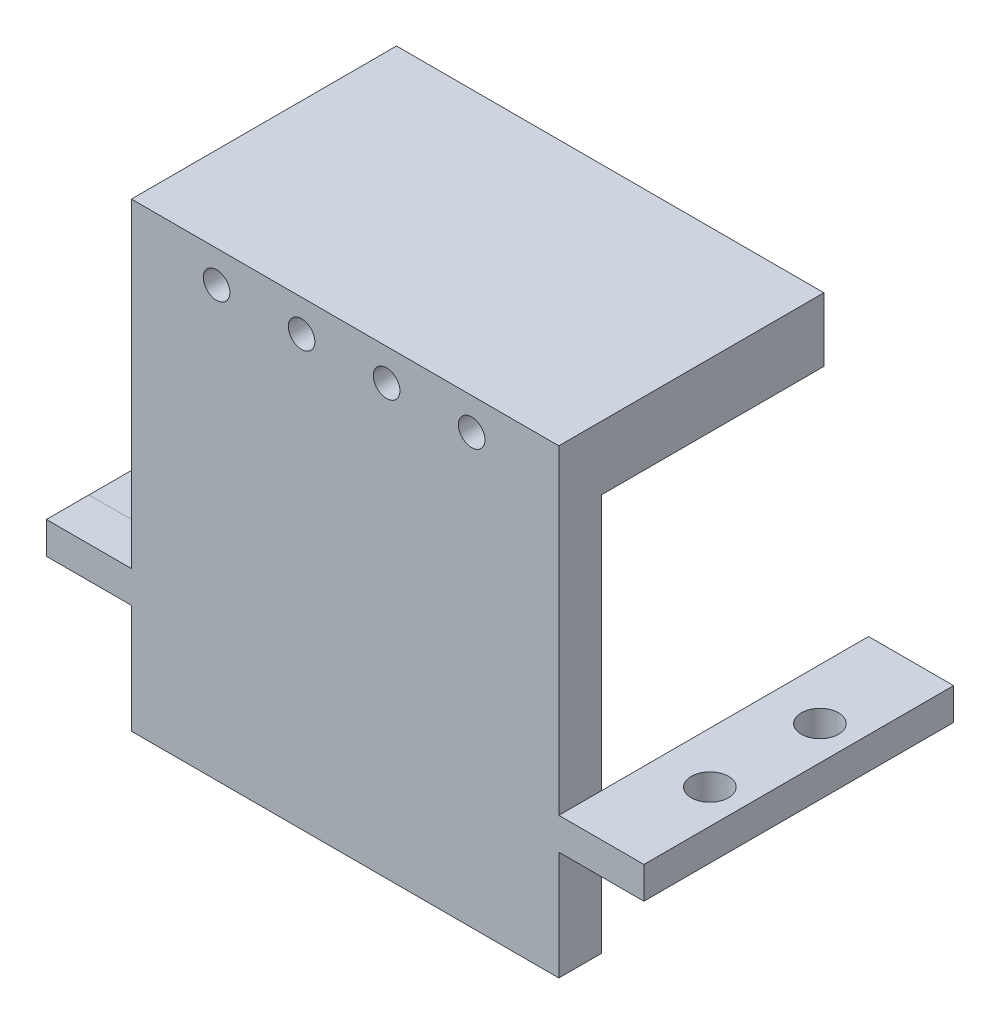
ISO-10303-21;
HEADER;
FILE_DESCRIPTION(('STEP AP214'),'2;1');
FILE_NAME('part.step','',(''),(''),'','','');
FILE_SCHEMA(('AUTOMOTIVE_DESIGN { 1 0 10303 214 1 1 1 1 }'));
ENDSEC;
DATA;
#1=APPLICATION_CONTEXT('core data for automotive mechanical design processes');
#2=APPLICATION_PROTOCOL_DEFINITION('international standard','automotive_design',2000,#1);
#3=PRODUCT_CONTEXT('',#1,'mechanical');
#4=PRODUCT('Part','Part','',(#3));
#5=PRODUCT_RELATED_PRODUCT_CATEGORY('part','',(#4));
#6=PRODUCT_DEFINITION_FORMATION('','',#4);
#7=PRODUCT_DEFINITION_CONTEXT('part definition',#1,'design');
#8=PRODUCT_DEFINITION('design','',#6,#7);
#9=PRODUCT_DEFINITION_SHAPE('','',#8);
#10=(LENGTH_UNIT() NAMED_UNIT(*) SI_UNIT(.MILLI.,.METRE.));
#11=(NAMED_UNIT(*) PLANE_ANGLE_UNIT() SI_UNIT($,.RADIAN.));
#12=(NAMED_UNIT(*) SI_UNIT($,.STERADIAN.) SOLID_ANGLE_UNIT());
#13=UNCERTAINTY_MEASURE_WITH_UNIT(LENGTH_MEASURE(1.E-05),#10,'distance_accuracy_value','');
#14=(GEOMETRIC_REPRESENTATION_CONTEXT(3) GLOBAL_UNCERTAINTY_ASSIGNED_CONTEXT((#13)) GLOBAL_UNIT_ASSIGNED_CONTEXT((#10,
#11,#12)) REPRESENTATION_CONTEXT('',''));
#15=CARTESIAN_POINT('',(0.,0.,0.));
#16=DIRECTION('',(0.,0.,1.));
#17=DIRECTION('',(1.,0.,0.));
#18=AXIS2_PLACEMENT_3D('',#15,#16,#17);
#19=CARTESIAN_POINT('',(0.,0.,-20.93));
#20=DIRECTION('',(0.,0.,1.));
#21=DIRECTION('',(1.,0.,0.));
#22=AXIS2_PLACEMENT_3D('',#19,#20,#21);
#23=PLANE('',#22);
#24=CARTESIAN_POINT('',(-106.644230049022,-11.0591164996487,-20.93));
#25=DIRECTION('',(0.,0.,1.));
#26=DIRECTION('',(1.,0.,0.));
#27=AXIS2_PLACEMENT_3D('',#24,#25,#26);
#28=CIRCLE('',#27,1.25);
#29=CARTESIAN_POINT('',(-105.394230049022,-11.0591164996487,-20.93));
#30=VERTEX_POINT('',#29);
#31=EDGE_CURVE('E367',#30,#30,#28,.F.);
#32=ORIENTED_EDGE('',*,*,#31,.F.);
#33=EDGE_LOOP('',(#32));
#34=FACE_BOUND('',#33,.T.);
#35=CARTESIAN_POINT('',(-122.644230049022,-11.0591164996487,-20.93));
#36=DIRECTION('',(0.,0.,1.));
#37=DIRECTION('',(1.,0.,0.));
#38=AXIS2_PLACEMENT_3D('',#35,#36,#37);
#39=CIRCLE('',#38,1.25);
#40=CARTESIAN_POINT('',(-121.394230049022,-11.0591164996487,-20.93));
#41=VERTEX_POINT('',#40);
#42=EDGE_CURVE('E370',#41,#41,#39,.F.);
#43=ORIENTED_EDGE('',*,*,#42,.F.);
#44=EDGE_LOOP('',(#43));
#45=FACE_BOUND('',#44,.T.);
#46=CARTESIAN_POINT('',(-114.644230049022,-11.0591164996487,-20.93));
#47=DIRECTION('',(0.,0.,1.));
#48=DIRECTION('',(1.,0.,0.));
#49=AXIS2_PLACEMENT_3D('',#46,#47,#48);
#50=CIRCLE('',#49,1.25);
#51=CARTESIAN_POINT('',(-113.394230049022,-11.0591164996487,-20.93));
#52=VERTEX_POINT('',#51);
#53=EDGE_CURVE('E355',#52,#52,#50,.F.);
#54=ORIENTED_EDGE('',*,*,#53,.F.);
#55=EDGE_LOOP('',(#54));
#56=FACE_BOUND('',#55,.T.);
#57=DIRECTION('',(0.,-1.,0.));
#58=VECTOR('',#57,1.);
#59=CARTESIAN_POINT('',(-98.4442300490215,-8.05911649459758,-20.93));
#60=LINE('',#59,#58);
#61=CARTESIAN_POINT('',(-98.4442300490215,-8.05911649459758,-20.93));
#62=VERTEX_POINT('',#61);
#63=CARTESIAN_POINT('',(-98.4442300490215,-14.0591164945976,-20.93));
#64=VERTEX_POINT('',#63);
#65=EDGE_CURVE('E354',#62,#64,#60,.T.);
#66=ORIENTED_EDGE('',*,*,#65,.T.);
#67=DIRECTION('',(-1.,0.,0.));
#68=VECTOR('',#67,1.);
#69=CARTESIAN_POINT('',(-138.644230049022,-14.0591164945976,-20.93));
#70=LINE('',#69,#68);
#71=CARTESIAN_POINT('',(-138.644230049022,-14.0591164945976,-20.93));
#72=VERTEX_POINT('',#71);
#73=EDGE_CURVE('E360',#64,#72,#70,.T.);
#74=ORIENTED_EDGE('',*,*,#73,.T.);
#75=DIRECTION('',(0.,1.,0.));
#76=VECTOR('',#75,1.);
#77=CARTESIAN_POINT('',(-138.644230049022,-14.0591164945976,-20.93));
#78=LINE('',#77,#76);
#79=CARTESIAN_POINT('',(-138.644230049022,-8.05911649459758,-20.93));
#80=VERTEX_POINT('',#79);
#81=EDGE_CURVE('E357',#72,#80,#78,.T.);
#82=ORIENTED_EDGE('',*,*,#81,.T.);
#83=DIRECTION('',(1.,0.,0.));
#84=VECTOR('',#83,1.);
#85=CARTESIAN_POINT('',(-138.644230049022,-8.05911649459758,-20.93));
#86=LINE('',#85,#84);
#87=EDGE_CURVE('E350',#80,#62,#86,.T.);
#88=ORIENTED_EDGE('',*,*,#87,.T.);
#89=EDGE_LOOP('',(#66,#74,#82,#88));
#90=FACE_BOUND('',#89,.T.);
#91=CARTESIAN_POINT('',(-130.63625074283,-11.0591164945976,-20.93));
#92=DIRECTION('',(0.,0.,1.));
#93=DIRECTION('',(1.,0.,0.));
#94=AXIS2_PLACEMENT_3D('',#91,#92,#93);
#95=CIRCLE('',#94,1.25000000000001);
#96=CARTESIAN_POINT('',(-129.38625074283,-11.0591164945976,-20.93));
#97=VERTEX_POINT('',#96);
#98=EDGE_CURVE('E40',#97,#97,#95,.F.);
#99=ORIENTED_EDGE('',*,*,#98,.F.);
#100=EDGE_LOOP('',(#99));
#101=FACE_BOUND('',#100,.T.);
#102=ADVANCED_FACE('F36',(#34,#45,#56,#90,#101),#23,.F.);
#103=CARTESIAN_POINT('',(0.,0.,0.));
#104=DIRECTION('',(0.,0.,1.));
#105=DIRECTION('',(1.,0.,0.));
#106=AXIS2_PLACEMENT_3D('',#103,#104,#105);
#107=PLANE('',#106);
#108=DIRECTION('',(-1.,0.,0.));
#109=VECTOR('',#108,1.);
#110=CARTESIAN_POINT('',(-138.644230049022,-14.0591164945976,0.));
#111=LINE('',#110,#109);
#112=CARTESIAN_POINT('',(-98.4442300490215,-14.0591164945976,0.));
#113=VERTEX_POINT('',#112);
#114=CARTESIAN_POINT('',(-138.644230049022,-14.0591164945976,0.));
#115=VERTEX_POINT('',#114);
#116=EDGE_CURVE('E351',#113,#115,#111,.T.);
#117=ORIENTED_EDGE('',*,*,#116,.F.);
#118=DIRECTION('',(0.,1.,0.));
#119=VECTOR('',#118,1.);
#120=CARTESIAN_POINT('',(-98.4442300490215,0.,0.));
#121=LINE('',#120,#119);
#122=CARTESIAN_POINT('',(-98.4442300490215,-38.1591164945976,0.));
#123=VERTEX_POINT('',#122);
#124=EDGE_CURVE('E154',#123,#113,#121,.T.);
#125=ORIENTED_EDGE('',*,*,#124,.F.);
#126=DIRECTION('',(0.,1.,0.));
#127=VECTOR('',#126,1.);
#128=CARTESIAN_POINT('',(-98.4442300490215,-41.1591164945976,0.));
#129=LINE('',#128,#127);
#130=CARTESIAN_POINT('',(-98.4442300490216,-41.1591164945976,0.));
#131=VERTEX_POINT('',#130);
#132=EDGE_CURVE('E217',#131,#123,#129,.T.);
#133=ORIENTED_EDGE('',*,*,#132,.F.);
#134=DIRECTION('',(0.,-1.,0.));
#135=VECTOR('',#134,1.);
#136=CARTESIAN_POINT('',(-98.4442300490216,0.,0.));
#137=LINE('',#136,#135);
#138=CARTESIAN_POINT('',(-98.4442300490216,-51.4091164945976,0.));
#139=VERTEX_POINT('',#138);
#140=EDGE_CURVE('E150',#131,#139,#137,.T.);
#141=ORIENTED_EDGE('',*,*,#140,.T.);
#142=DIRECTION('',(-1.,0.,0.));
#143=VECTOR('',#142,1.);
#144=CARTESIAN_POINT('',(0.,-51.4091164945976,0.));
#145=LINE('',#144,#143);
#146=CARTESIAN_POINT('',(-138.644230049022,-51.4091164945976,0.));
#147=VERTEX_POINT('',#146);
#148=EDGE_CURVE('E148',#139,#147,#145,.T.);
#149=ORIENTED_EDGE('',*,*,#148,.T.);
#150=DIRECTION('',(0.,1.,0.));
#151=VECTOR('',#150,1.);
#152=CARTESIAN_POINT('',(-138.644230049022,0.,0.));
#153=LINE('',#152,#151);
#154=CARTESIAN_POINT('',(-138.644230049022,-41.1591164945976,0.));
#155=VERTEX_POINT('',#154);
#156=EDGE_CURVE('E165',#147,#155,#153,.T.);
#157=ORIENTED_EDGE('',*,*,#156,.T.);
#158=DIRECTION('',(0.,1.,0.));
#159=VECTOR('',#158,1.);
#160=CARTESIAN_POINT('',(-138.644230049022,0.,0.));
#161=LINE('',#160,#159);
#162=CARTESIAN_POINT('',(-138.644230049022,-38.1591164945976,0.));
#163=VERTEX_POINT('',#162);
#164=EDGE_CURVE('E238',#155,#163,#161,.T.);
#165=ORIENTED_EDGE('',*,*,#164,.T.);
#166=DIRECTION('',(0.,1.,0.));
#167=VECTOR('',#166,1.);
#168=CARTESIAN_POINT('',(-138.644230049022,0.,0.));
#169=LINE('',#168,#167);
#170=EDGE_CURVE('E157',#163,#115,#169,.T.);
#171=ORIENTED_EDGE('',*,*,#170,.T.);
#172=EDGE_LOOP('',(#117,#125,#133,#141,#149,#157,#165,#171));
#173=FACE_BOUND('',#172,.T.);
#174=ADVANCED_FACE('F288',(#173),#107,.F.);
#175=CARTESIAN_POINT('',(0.,-51.4091164945976,4.));
#176=DIRECTION('',(0.,-1.,0.));
#177=DIRECTION('',(0.,0.,-1.));
#178=AXIS2_PLACEMENT_3D('',#175,#176,#177);
#179=PLANE('',#178);
#180=ORIENTED_EDGE('',*,*,#148,.F.);
#181=DIRECTION('',(0.,0.,-1.));
#182=VECTOR('',#181,1.);
#183=CARTESIAN_POINT('',(-98.4442300490216,-51.4091164945976,4.));
#184=LINE('',#183,#182);
#185=CARTESIAN_POINT('',(-98.4442300490216,-51.4091164945976,4.));
#186=VERTEX_POINT('',#185);
#187=EDGE_CURVE('E11',#186,#139,#184,.T.);
#188=ORIENTED_EDGE('',*,*,#187,.F.);
#189=DIRECTION('',(-1.,0.,0.));
#190=VECTOR('',#189,1.);
#191=CARTESIAN_POINT('',(0.,-51.4091164945976,4.));
#192=LINE('',#191,#190);
#193=CARTESIAN_POINT('',(-138.644230049022,-51.4091164945976,4.));
#194=VERTEX_POINT('',#193);
#195=EDGE_CURVE('E168',#186,#194,#192,.T.);
#196=ORIENTED_EDGE('',*,*,#195,.T.);
#197=DIRECTION('',(0.,0.,-1.));
#198=VECTOR('',#197,1.);
#199=CARTESIAN_POINT('',(-138.644230049022,-51.4091164945976,4.));
#200=LINE('',#199,#198);
#201=EDGE_CURVE('E62',#194,#147,#200,.T.);
#202=ORIENTED_EDGE('',*,*,#201,.T.);
#203=EDGE_LOOP('',(#180,#188,#196,#202));
#204=FACE_BOUND('',#203,.T.);
#205=ADVANCED_FACE('F38',(#204),#179,.T.);
#206=CARTESIAN_POINT('',(-98.4442300490216,0.,4.));
#207=DIRECTION('',(1.,0.,0.));
#208=DIRECTION('',(0.,0.,-1.));
#209=AXIS2_PLACEMENT_3D('',#206,#207,#208);
#210=PLANE('',#209);
#211=ORIENTED_EDGE('',*,*,#140,.F.);
#212=DIRECTION('',(0.,0.,-1.));
#213=VECTOR('',#212,1.);
#214=CARTESIAN_POINT('',(-98.4442300490216,-41.1591164945976,4.));
#215=LINE('',#214,#213);
#216=CARTESIAN_POINT('',(-98.4442300490216,-41.1591164945976,4.));
#217=VERTEX_POINT('',#216);
#218=EDGE_CURVE('E45',#217,#131,#215,.T.);
#219=ORIENTED_EDGE('',*,*,#218,.F.);
#220=DIRECTION('',(0.,-1.,0.));
#221=VECTOR('',#220,1.);
#222=CARTESIAN_POINT('',(-98.4442300490216,0.,4.));
#223=LINE('',#222,#221);
#224=EDGE_CURVE('E257',#217,#186,#223,.T.);
#225=ORIENTED_EDGE('',*,*,#224,.T.);
#226=ORIENTED_EDGE('',*,*,#187,.T.);
#227=EDGE_LOOP('',(#211,#219,#225,#226));
#228=FACE_BOUND('',#227,.T.);
#229=ADVANCED_FACE('F299',(#228),#210,.T.);
#230=CARTESIAN_POINT('',(0.,-41.1591164945976,4.));
#231=DIRECTION('',(0.,-1.,0.));
#232=DIRECTION('',(0.,0.,-1.));
#233=AXIS2_PLACEMENT_3D('',#230,#231,#232);
#234=PLANE('',#233);
#235=CARTESIAN_POINT('',(-93.6442300622939,-41.1591164945976,-15.7549999999999));
#236=DIRECTION('',(0.,-1.,0.));
#237=DIRECTION('',(0.,0.,-1.));
#238=AXIS2_PLACEMENT_3D('',#235,#236,#237);
#239=CIRCLE('',#238,1.75);
#240=CARTESIAN_POINT('',(-93.6442300622939,-41.1591164945976,-17.5049999999999));
#241=VERTEX_POINT('',#240);
#242=EDGE_CURVE('E208',#241,#241,#239,.T.);
#243=ORIENTED_EDGE('',*,*,#242,.F.);
#244=EDGE_LOOP('',(#243));
#245=FACE_BOUND('',#244,.T.);
#246=CARTESIAN_POINT('',(-93.6442300622939,-41.1591164945976,-5.40499999999994));
#247=DIRECTION('',(0.,-1.,0.));
#248=DIRECTION('',(0.,0.,-1.));
#249=AXIS2_PLACEMENT_3D('',#246,#247,#248);
#250=CIRCLE('',#249,1.75);
#251=CARTESIAN_POINT('',(-93.6442300622939,-41.1591164945976,-7.15499999999994));
#252=VERTEX_POINT('',#251);
#253=EDGE_CURVE('E214',#252,#252,#250,.T.);
#254=ORIENTED_EDGE('',*,*,#253,.F.);
#255=EDGE_LOOP('',(#254));
#256=FACE_BOUND('',#255,.T.);
#257=ORIENTED_EDGE('',*,*,#218,.T.);
#258=DIRECTION('',(0.,0.,1.));
#259=VECTOR('',#258,1.);
#260=CARTESIAN_POINT('',(-98.4442300490215,-41.1591164945976,-25.13));
#261=LINE('',#260,#259);
#262=CARTESIAN_POINT('',(-98.4442300490215,-41.1591164945976,-25.13));
#263=VERTEX_POINT('',#262);
#264=EDGE_CURVE('E235',#263,#131,#261,.T.);
#265=ORIENTED_EDGE('',*,*,#264,.F.);
#266=DIRECTION('',(-1.,0.,0.));
#267=VECTOR('',#266,1.);
#268=CARTESIAN_POINT('',(-90.4442300490216,-41.1591164945976,-25.13));
#269=LINE('',#268,#267);
#270=CARTESIAN_POINT('',(-90.4442300490216,-41.1591164945976,-25.13));
#271=VERTEX_POINT('',#270);
#272=EDGE_CURVE('E221',#271,#263,#269,.T.);
#273=ORIENTED_EDGE('',*,*,#272,.F.);
#274=DIRECTION('',(0.,0.,-1.));
#275=VECTOR('',#274,1.);
#276=CARTESIAN_POINT('',(-90.4442300490216,-41.1591164945976,4.));
#277=LINE('',#276,#275);
#278=CARTESIAN_POINT('',(-90.4442300490216,-41.1591164945976,4.));
#279=VERTEX_POINT('',#278);
#280=EDGE_CURVE('E180',#279,#271,#277,.T.);
#281=ORIENTED_EDGE('',*,*,#280,.F.);
#282=DIRECTION('',(-1.,0.,0.));
#283=VECTOR('',#282,1.);
#284=CARTESIAN_POINT('',(0.,-41.1591164945976,4.));
#285=LINE('',#284,#283);
#286=EDGE_CURVE('E260',#279,#217,#285,.T.);
#287=ORIENTED_EDGE('',*,*,#286,.T.);
#288=EDGE_LOOP('',(#257,#265,#273,#281,#287));
#289=FACE_BOUND('',#288,.T.);
#290=ADVANCED_FACE('F302',(#245,#256,#289),#234,.T.);
#291=CARTESIAN_POINT('',(-90.4442300490216,0.,4.));
#292=DIRECTION('',(1.,0.,0.));
#293=DIRECTION('',(0.,0.,-1.));
#294=AXIS2_PLACEMENT_3D('',#291,#292,#293);
#295=PLANE('',#294);
#296=ORIENTED_EDGE('',*,*,#280,.T.);
#297=DIRECTION('',(0.,-1.,0.));
#298=VECTOR('',#297,1.);
#299=CARTESIAN_POINT('',(-90.4442300490216,-41.1591164945976,-25.13));
#300=LINE('',#299,#298);
#301=CARTESIAN_POINT('',(-90.4442300490216,-38.1591164945976,-25.13));
#302=VERTEX_POINT('',#301);
#303=EDGE_CURVE('E218',#302,#271,#300,.T.);
#304=ORIENTED_EDGE('',*,*,#303,.F.);
#305=DIRECTION('',(0.,0.,-1.));
#306=VECTOR('',#305,1.);
#307=CARTESIAN_POINT('',(-90.4442300490216,-38.1591164945976,4.));
#308=LINE('',#307,#306);
#309=CARTESIAN_POINT('',(-90.4442300490216,-38.1591164945976,4.));
#310=VERTEX_POINT('',#309);
#311=EDGE_CURVE('E177',#310,#302,#308,.T.);
#312=ORIENTED_EDGE('',*,*,#311,.F.);
#313=DIRECTION('',(0.,-1.,0.));
#314=VECTOR('',#313,1.);
#315=CARTESIAN_POINT('',(-90.4442300490216,0.,4.));
#316=LINE('',#315,#314);
#317=EDGE_CURVE('E263',#310,#279,#316,.T.);
#318=ORIENTED_EDGE('',*,*,#317,.T.);
#319=EDGE_LOOP('',(#296,#304,#312,#318));
#320=FACE_BOUND('',#319,.T.);
#321=ADVANCED_FACE('F309',(#320),#295,.T.);
#322=CARTESIAN_POINT('',(0.,-38.1591164945976,4.));
#323=DIRECTION('',(0.,1.,0.));
#324=DIRECTION('',(0.,0.,1.));
#325=AXIS2_PLACEMENT_3D('',#322,#323,#324);
#326=PLANE('',#325);
#327=CARTESIAN_POINT('',(-93.6442300622939,-38.1591164945977,-15.7549999999999));
#328=DIRECTION('',(0.,1.,0.));
#329=DIRECTION('',(-1.,0.,0.));
#330=AXIS2_PLACEMENT_3D('',#327,#328,#329);
#331=CIRCLE('',#330,1.75);
#332=CARTESIAN_POINT('',(-95.3942300622939,-38.1591164945977,-15.7549999999999));
#333=VERTEX_POINT('',#332);
#334=EDGE_CURVE('E187',#333,#333,#331,.T.);
#335=ORIENTED_EDGE('',*,*,#334,.F.);
#336=EDGE_LOOP('',(#335));
#337=FACE_BOUND('',#336,.T.);
#338=CARTESIAN_POINT('',(-93.6442300622939,-38.1591164945977,-5.40499999999994));
#339=DIRECTION('',(0.,1.,0.));
#340=DIRECTION('',(-1.,0.,0.));
#341=AXIS2_PLACEMENT_3D('',#338,#339,#340);
#342=CIRCLE('',#341,1.75);
#343=CARTESIAN_POINT('',(-95.3942300622939,-38.1591164945977,-5.40499999999994));
#344=VERTEX_POINT('',#343);
#345=EDGE_CURVE('E211',#344,#344,#342,.T.);
#346=ORIENTED_EDGE('',*,*,#345,.F.);
#347=EDGE_LOOP('',(#346));
#348=FACE_BOUND('',#347,.T.);
#349=ORIENTED_EDGE('',*,*,#311,.T.);
#350=DIRECTION('',(1.,0.,0.));
#351=VECTOR('',#350,1.);
#352=CARTESIAN_POINT('',(-90.4442300490216,-38.1591164945976,-25.13));
#353=LINE('',#352,#351);
#354=CARTESIAN_POINT('',(-98.4442300490215,-38.1591164945976,-25.13));
#355=VERTEX_POINT('',#354);
#356=EDGE_CURVE('E227',#355,#302,#353,.T.);
#357=ORIENTED_EDGE('',*,*,#356,.F.);
#358=DIRECTION('',(0.,0.,1.));
#359=VECTOR('',#358,1.);
#360=CARTESIAN_POINT('',(-98.4442300490215,-38.1591164945976,-25.13));
#361=LINE('',#360,#359);
#362=EDGE_CURVE('E230',#355,#123,#361,.T.);
#363=ORIENTED_EDGE('',*,*,#362,.T.);
#364=DIRECTION('',(0.,0.,-1.));
#365=VECTOR('',#364,1.);
#366=CARTESIAN_POINT('',(-98.4442300490215,-38.1591164945976,4.));
#367=LINE('',#366,#365);
#368=CARTESIAN_POINT('',(-98.4442300490215,-38.1591164945976,4.));
#369=VERTEX_POINT('',#368);
#370=EDGE_CURVE('E175',#369,#123,#367,.T.);
#371=ORIENTED_EDGE('',*,*,#370,.F.);
#372=DIRECTION('',(1.,0.,0.));
#373=VECTOR('',#372,1.);
#374=CARTESIAN_POINT('',(0.,-38.1591164945976,4.));
#375=LINE('',#374,#373);
#376=EDGE_CURVE('E266',#369,#310,#375,.T.);
#377=ORIENTED_EDGE('',*,*,#376,.T.);
#378=EDGE_LOOP('',(#349,#357,#363,#371,#377));
#379=FACE_BOUND('',#378,.T.);
#380=ADVANCED_FACE('F314',(#337,#348,#379),#326,.T.);
#381=CARTESIAN_POINT('',(-98.4442300490215,0.,4.));
#382=DIRECTION('',(-1.,0.,0.));
#383=DIRECTION('',(0.,0.,1.));
#384=AXIS2_PLACEMENT_3D('',#381,#382,#383);
#385=PLANE('',#384);
#386=ORIENTED_EDGE('',*,*,#124,.T.);
#387=DIRECTION('',(0.,0.,1.));
#388=VECTOR('',#387,1.);
#389=CARTESIAN_POINT('',(-98.4442300490215,-14.0591164945976,-20.93));
#390=LINE('',#389,#388);
#391=EDGE_CURVE('E342',#64,#113,#390,.T.);
#392=ORIENTED_EDGE('',*,*,#391,.F.);
#393=ORIENTED_EDGE('',*,*,#65,.F.);
#394=DIRECTION('',(0.,0.,-1.));
#395=VECTOR('',#394,1.);
#396=CARTESIAN_POINT('',(-98.4442300490215,-8.05911649459756,0.));
#397=LINE('',#396,#395);
#398=CARTESIAN_POINT('',(-98.4442300490215,-8.05911649459756,4.));
#399=VERTEX_POINT('',#398);
#400=EDGE_CURVE('E197',#399,#62,#397,.T.);
#401=ORIENTED_EDGE('',*,*,#400,.F.);
#402=DIRECTION('',(0.,1.,0.));
#403=VECTOR('',#402,1.);
#404=CARTESIAN_POINT('',(-98.4442300490215,0.,4.));
#405=LINE('',#404,#403);
#406=EDGE_CURVE('E269',#369,#399,#405,.T.);
#407=ORIENTED_EDGE('',*,*,#406,.F.);
#408=ORIENTED_EDGE('',*,*,#370,.T.);
#409=EDGE_LOOP('',(#386,#392,#393,#401,#407,#408));
#410=FACE_BOUND('',#409,.T.);
#411=ADVANCED_FACE('F327',(#410),#385,.F.);
#412=CARTESIAN_POINT('',(-138.644230049022,0.,4.));
#413=DIRECTION('',(-1.,0.,0.));
#414=DIRECTION('',(0.,0.,1.));
#415=AXIS2_PLACEMENT_3D('',#412,#413,#414);
#416=PLANE('',#415);
#417=ORIENTED_EDGE('',*,*,#170,.F.);
#418=DIRECTION('',(0.,0.,-1.));
#419=VECTOR('',#418,1.);
#420=CARTESIAN_POINT('',(-138.644230049022,-38.1591164945976,4.));
#421=LINE('',#420,#419);
#422=CARTESIAN_POINT('',(-138.644230049022,-38.1591164945976,4.));
#423=VERTEX_POINT('',#422);
#424=EDGE_CURVE('E172',#423,#163,#421,.T.);
#425=ORIENTED_EDGE('',*,*,#424,.F.);
#426=DIRECTION('',(0.,1.,0.));
#427=VECTOR('',#426,1.);
#428=CARTESIAN_POINT('',(-138.644230049022,0.,4.));
#429=LINE('',#428,#427);
#430=CARTESIAN_POINT('',(-138.644230049022,-8.05911649459756,4.));
#431=VERTEX_POINT('',#430);
#432=EDGE_CURVE('E272',#423,#431,#429,.T.);
#433=ORIENTED_EDGE('',*,*,#432,.T.);
#434=DIRECTION('',(0.,0.,1.));
#435=VECTOR('',#434,1.);
#436=CARTESIAN_POINT('',(-138.644230049022,-8.05911649459756,0.));
#437=LINE('',#436,#435);
#438=EDGE_CURVE('E341',#80,#431,#437,.T.);
#439=ORIENTED_EDGE('',*,*,#438,.F.);
#440=ORIENTED_EDGE('',*,*,#81,.F.);
#441=DIRECTION('',(0.,0.,1.));
#442=VECTOR('',#441,1.);
#443=CARTESIAN_POINT('',(-138.644230049022,-14.0591164945976,-20.93));
#444=LINE('',#443,#442);
#445=EDGE_CURVE('E347',#72,#115,#444,.T.);
#446=ORIENTED_EDGE('',*,*,#445,.T.);
#447=EDGE_LOOP('',(#417,#425,#433,#439,#440,#446));
#448=FACE_BOUND('',#447,.T.);
#449=ADVANCED_FACE('F456',(#448),#416,.T.);
#450=CARTESIAN_POINT('',(0.,-38.1591164945976,4.));
#451=DIRECTION('',(0.,1.,0.));
#452=DIRECTION('',(0.,0.,1.));
#453=AXIS2_PLACEMENT_3D('',#450,#451,#452);
#454=PLANE('',#453);
#455=DIRECTION('',(1.,0.,0.));
#456=VECTOR('',#455,1.);
#457=CARTESIAN_POINT('',(0.,-38.1591164945976,0.));
#458=LINE('',#457,#456);
#459=CARTESIAN_POINT('',(-146.644230049022,-38.1591164945976,0.));
#460=VERTEX_POINT('',#459);
#461=EDGE_CURVE('E160',#460,#163,#458,.T.);
#462=ORIENTED_EDGE('',*,*,#461,.F.);
#463=DIRECTION('',(0.,0.,-1.));
#464=VECTOR('',#463,1.);
#465=CARTESIAN_POINT('',(-146.644230049022,-38.1591164945976,4.));
#466=LINE('',#465,#464);
#467=CARTESIAN_POINT('',(-146.644230049022,-38.1591164945976,4.));
#468=VERTEX_POINT('',#467);
#469=EDGE_CURVE('E127',#468,#460,#466,.T.);
#470=ORIENTED_EDGE('',*,*,#469,.F.);
#471=DIRECTION('',(1.,0.,0.));
#472=VECTOR('',#471,1.);
#473=CARTESIAN_POINT('',(0.,-38.1591164945976,4.));
#474=LINE('',#473,#472);
#475=EDGE_CURVE('E138',#468,#423,#474,.T.);
#476=ORIENTED_EDGE('',*,*,#475,.T.);
#477=ORIENTED_EDGE('',*,*,#424,.T.);
#478=EDGE_LOOP('',(#462,#470,#476,#477));
#479=FACE_BOUND('',#478,.T.);
#480=ADVANCED_FACE('F276',(#479),#454,.T.);
#481=CARTESIAN_POINT('',(-146.644230049022,0.,4.));
#482=DIRECTION('',(-1.,0.,0.));
#483=DIRECTION('',(0.,0.,1.));
#484=AXIS2_PLACEMENT_3D('',#481,#482,#483);
#485=PLANE('',#484);
#486=DIRECTION('',(0.,1.,0.));
#487=VECTOR('',#486,1.);
#488=CARTESIAN_POINT('',(-146.644230049022,0.,0.));
#489=LINE('',#488,#487);
#490=CARTESIAN_POINT('',(-146.644230049022,-38.1655725309547,0.));
#491=VERTEX_POINT('',#490);
#492=EDGE_CURVE('E163',#491,#460,#489,.T.);
#493=ORIENTED_EDGE('',*,*,#492,.F.);
#494=DIRECTION('',(0.,0.,1.));
#495=VECTOR('',#494,1.);
#496=CARTESIAN_POINT('',(-146.644230049022,-38.1655725309547,-25.13));
#497=LINE('',#496,#495);
#498=CARTESIAN_POINT('',(-146.644230049022,-38.1655725309547,-25.13));
#499=VERTEX_POINT('',#498);
#500=EDGE_CURVE('E53',#499,#491,#497,.T.);
#501=ORIENTED_EDGE('',*,*,#500,.F.);
#502=DIRECTION('',(0.,1.,0.));
#503=VECTOR('',#502,1.);
#504=CARTESIAN_POINT('',(-146.644230049022,0.,-25.13));
#505=LINE('',#504,#503);
#506=CARTESIAN_POINT('',(-146.644230049022,-41.1591164945976,-25.13));
#507=VERTEX_POINT('',#506);
#508=EDGE_CURVE('E122',#507,#499,#505,.T.);
#509=ORIENTED_EDGE('',*,*,#508,.F.);
#510=DIRECTION('',(0.,0.,-1.));
#511=VECTOR('',#510,1.);
#512=CARTESIAN_POINT('',(-146.644230049022,-41.1591164945976,4.));
#513=LINE('',#512,#511);
#514=CARTESIAN_POINT('',(-146.644230049022,-41.1591164945976,4.));
#515=VERTEX_POINT('',#514);
#516=EDGE_CURVE('E114',#515,#507,#513,.T.);
#517=ORIENTED_EDGE('',*,*,#516,.F.);
#518=DIRECTION('',(0.,1.,0.));
#519=VECTOR('',#518,1.);
#520=CARTESIAN_POINT('',(-146.644230049022,0.,4.));
#521=LINE('',#520,#519);
#522=EDGE_CURVE('E119',#515,#468,#521,.T.);
#523=ORIENTED_EDGE('',*,*,#522,.T.);
#524=ORIENTED_EDGE('',*,*,#469,.T.);
#525=EDGE_LOOP('',(#493,#501,#509,#517,#523,#524));
#526=FACE_BOUND('',#525,.T.);
#527=ADVANCED_FACE('F117',(#526),#485,.T.);
#528=CARTESIAN_POINT('',(0.,-41.1591164945976,4.));
#529=DIRECTION('',(0.,-1.,0.));
#530=DIRECTION('',(0.,0.,-1.));
#531=AXIS2_PLACEMENT_3D('',#528,#529,#530);
#532=PLANE('',#531);
#533=CARTESIAN_POINT('',(-143.444230049021,-41.1591164945976,-5.40499999999994));
#534=DIRECTION('',(0.,-1.,0.));
#535=DIRECTION('',(0.,0.,-1.));
#536=AXIS2_PLACEMENT_3D('',#533,#534,#535);
#537=CIRCLE('',#536,1.75000000000001);
#538=CARTESIAN_POINT('',(-143.444230049021,-41.1591164945976,-7.15499999999995));
#539=VERTEX_POINT('',#538);
#540=EDGE_CURVE('E191',#539,#539,#537,.T.);
#541=ORIENTED_EDGE('',*,*,#540,.F.);
#542=EDGE_LOOP('',(#541));
#543=FACE_BOUND('',#542,.T.);
#544=CARTESIAN_POINT('',(-143.444230049022,-41.1591164945976,-15.7549999999999));
#545=DIRECTION('',(0.,-1.,0.));
#546=DIRECTION('',(0.,0.,-1.));
#547=AXIS2_PLACEMENT_3D('',#544,#545,#546);
#548=CIRCLE('',#547,1.75000000000001);
#549=CARTESIAN_POINT('',(-143.444230049022,-41.1591164945976,-17.505));
#550=VERTEX_POINT('',#549);
#551=EDGE_CURVE('E188',#550,#550,#548,.T.);
#552=ORIENTED_EDGE('',*,*,#551,.F.);
#553=EDGE_LOOP('',(#552));
#554=FACE_BOUND('',#553,.T.);
#555=ORIENTED_EDGE('',*,*,#516,.T.);
#556=DIRECTION('',(-1.,0.,0.));
#557=VECTOR('',#556,1.);
#558=CARTESIAN_POINT('',(0.,-41.1591164945976,-25.13));
#559=LINE('',#558,#557);
#560=CARTESIAN_POINT('',(-138.644230049022,-41.1591164945976,-25.13));
#561=VERTEX_POINT('',#560);
#562=EDGE_CURVE('E242',#561,#507,#559,.T.);
#563=ORIENTED_EDGE('',*,*,#562,.F.);
#564=DIRECTION('',(0.,0.,1.));
#565=VECTOR('',#564,1.);
#566=CARTESIAN_POINT('',(-138.644230049022,-41.1591164945976,-25.13));
#567=LINE('',#566,#565);
#568=EDGE_CURVE('E151',#561,#155,#567,.T.);
#569=ORIENTED_EDGE('',*,*,#568,.T.);
#570=DIRECTION('',(0.,0.,-1.));
#571=VECTOR('',#570,1.);
#572=CARTESIAN_POINT('',(-138.644230049022,-41.1591164945976,4.));
#573=LINE('',#572,#571);
#574=CARTESIAN_POINT('',(-138.644230049022,-41.1591164945976,4.));
#575=VERTEX_POINT('',#574);
#576=EDGE_CURVE('E128',#575,#155,#573,.T.);
#577=ORIENTED_EDGE('',*,*,#576,.F.);
#578=DIRECTION('',(-1.,0.,0.));
#579=VECTOR('',#578,1.);
#580=CARTESIAN_POINT('',(0.,-41.1591164945976,4.));
#581=LINE('',#580,#579);
#582=EDGE_CURVE('E135',#575,#515,#581,.T.);
#583=ORIENTED_EDGE('',*,*,#582,.T.);
#584=EDGE_LOOP('',(#555,#563,#569,#577,#583));
#585=FACE_BOUND('',#584,.T.);
#586=ADVANCED_FACE('F140',(#543,#554,#585),#532,.T.);
#587=CARTESIAN_POINT('',(-138.644230049022,0.,4.));
#588=DIRECTION('',(-1.,0.,0.));
#589=DIRECTION('',(0.,0.,1.));
#590=AXIS2_PLACEMENT_3D('',#587,#588,#589);
#591=PLANE('',#590);
#592=ORIENTED_EDGE('',*,*,#156,.F.);
#593=ORIENTED_EDGE('',*,*,#201,.F.);
#594=DIRECTION('',(0.,1.,0.));
#595=VECTOR('',#594,1.);
#596=CARTESIAN_POINT('',(-138.644230049022,0.,4.));
#597=LINE('',#596,#595);
#598=EDGE_CURVE('E143',#194,#575,#597,.T.);
#599=ORIENTED_EDGE('',*,*,#598,.T.);
#600=ORIENTED_EDGE('',*,*,#576,.T.);
#601=EDGE_LOOP('',(#592,#593,#599,#600));
#602=FACE_BOUND('',#601,.T.);
#603=ADVANCED_FACE('F294',(#602),#591,.T.);
#604=CARTESIAN_POINT('',(0.,0.,4.));
#605=DIRECTION('',(0.,0.,1.));
#606=DIRECTION('',(1.,0.,0.));
#607=AXIS2_PLACEMENT_3D('',#604,#605,#606);
#608=PLANE('',#607);
#609=CARTESIAN_POINT('',(-106.644230049021,-11.0591164945976,4.));
#610=DIRECTION('',(0.,0.,1.));
#611=DIRECTION('',(1.,0.,0.));
#612=AXIS2_PLACEMENT_3D('',#609,#610,#611);
#613=CIRCLE('',#612,1.25);
#614=CARTESIAN_POINT('',(-105.394230049021,-11.0591164945976,4.));
#615=VERTEX_POINT('',#614);
#616=EDGE_CURVE('E379',#615,#615,#613,.F.);
#617=ORIENTED_EDGE('',*,*,#616,.T.);
#618=EDGE_LOOP('',(#617));
#619=FACE_BOUND('',#618,.T.);
#620=CARTESIAN_POINT('',(-130.63625074283,-11.0591164945976,4.));
#621=DIRECTION('',(0.,0.,1.));
#622=DIRECTION('',(1.,0.,0.));
#623=AXIS2_PLACEMENT_3D('',#620,#621,#622);
#624=CIRCLE('',#623,1.25000000000001);
#625=CARTESIAN_POINT('',(-129.38625074283,-11.0591164945976,4.));
#626=VERTEX_POINT('',#625);
#627=EDGE_CURVE('E376',#626,#626,#624,.F.);
#628=ORIENTED_EDGE('',*,*,#627,.T.);
#629=EDGE_LOOP('',(#628));
#630=FACE_BOUND('',#629,.T.);
#631=CARTESIAN_POINT('',(-114.644230049022,-11.0591164945976,4.));
#632=DIRECTION('',(0.,0.,1.));
#633=DIRECTION('',(1.,0.,0.));
#634=AXIS2_PLACEMENT_3D('',#631,#632,#633);
#635=CIRCLE('',#634,1.25);
#636=CARTESIAN_POINT('',(-113.394230049022,-11.0591164945976,4.));
#637=VERTEX_POINT('',#636);
#638=EDGE_CURVE('E382',#637,#637,#635,.F.);
#639=ORIENTED_EDGE('',*,*,#638,.T.);
#640=EDGE_LOOP('',(#639));
#641=FACE_BOUND('',#640,.T.);
#642=CARTESIAN_POINT('',(-122.644230049022,-11.0591164945976,4.));
#643=DIRECTION('',(0.,0.,1.));
#644=DIRECTION('',(1.,0.,0.));
#645=AXIS2_PLACEMENT_3D('',#642,#643,#644);
#646=CIRCLE('',#645,1.25);
#647=CARTESIAN_POINT('',(-121.394230049022,-11.0591164945976,4.));
#648=VERTEX_POINT('',#647);
#649=EDGE_CURVE('E373',#648,#648,#646,.F.);
#650=ORIENTED_EDGE('',*,*,#649,.T.);
#651=EDGE_LOOP('',(#650));
#652=FACE_BOUND('',#651,.T.);
#653=ORIENTED_EDGE('',*,*,#195,.F.);
#654=ORIENTED_EDGE('',*,*,#224,.F.);
#655=ORIENTED_EDGE('',*,*,#286,.F.);
#656=ORIENTED_EDGE('',*,*,#317,.F.);
#657=ORIENTED_EDGE('',*,*,#376,.F.);
#658=ORIENTED_EDGE('',*,*,#406,.T.);
#659=DIRECTION('',(1.,0.,0.));
#660=VECTOR('',#659,1.);
#661=CARTESIAN_POINT('',(-138.644230049022,-8.05911649459756,4.));
#662=LINE('',#661,#660);
#663=EDGE_CURVE('E202',#431,#399,#662,.T.);
#664=ORIENTED_EDGE('',*,*,#663,.F.);
#665=ORIENTED_EDGE('',*,*,#432,.F.);
#666=ORIENTED_EDGE('',*,*,#475,.F.);
#667=ORIENTED_EDGE('',*,*,#522,.F.);
#668=ORIENTED_EDGE('',*,*,#582,.F.);
#669=ORIENTED_EDGE('',*,*,#598,.F.);
#670=EDGE_LOOP('',(#653,#654,#655,#656,#657,#658,#664,#665,#666,#667,#668,#669));
#671=FACE_BOUND('',#670,.T.);
#672=ADVANCED_FACE('F133',(#619,#630,#641,#652,#671),#608,.T.);
#673=ORIENTED_EDGE('',*,*,#461,.T.);
#674=DIRECTION('',(-0.999999674371992,-0.000807004281861515,0.));
#675=VECTOR('',#674,1.);
#676=CARTESIAN_POINT('',(0.0307042675012804,-38.0472051923758,0.));
#677=LINE('',#676,#675);
#678=EDGE_CURVE('E243',#163,#491,#677,.T.);
#679=ORIENTED_EDGE('',*,*,#678,.T.);
#680=ORIENTED_EDGE('',*,*,#492,.T.);
#681=EDGE_LOOP('',(#673,#679,#680));
#682=FACE_BOUND('',#681,.T.);
#683=ADVANCED_FACE('F280',(#682),#107,.F.);
#684=CARTESIAN_POINT('',(-138.644230049022,0.,-25.13));
#685=DIRECTION('',(1.,0.,0.));
#686=DIRECTION('',(0.,0.,-1.));
#687=AXIS2_PLACEMENT_3D('',#684,#685,#686);
#688=PLANE('',#687);
#689=ORIENTED_EDGE('',*,*,#164,.F.);
#690=ORIENTED_EDGE('',*,*,#568,.F.);
#691=DIRECTION('',(0.,1.,0.));
#692=VECTOR('',#691,1.);
#693=CARTESIAN_POINT('',(-138.644230049022,0.,-25.13));
#694=LINE('',#693,#692);
#695=CARTESIAN_POINT('',(-138.644230049022,-38.1591164945976,-25.13));
#696=VERTEX_POINT('',#695);
#697=EDGE_CURVE('E239',#561,#696,#694,.T.);
#698=ORIENTED_EDGE('',*,*,#697,.T.);
#699=DIRECTION('',(0.,0.,1.));
#700=VECTOR('',#699,1.);
#701=CARTESIAN_POINT('',(-138.644230049022,-38.1591164945976,-25.13));
#702=LINE('',#701,#700);
#703=EDGE_CURVE('E248',#696,#163,#702,.T.);
#704=ORIENTED_EDGE('',*,*,#703,.T.);
#705=EDGE_LOOP('',(#689,#690,#698,#704));
#706=FACE_BOUND('',#705,.T.);
#707=ADVANCED_FACE('F292',(#706),#688,.T.);
#708=CARTESIAN_POINT('',(0.0307042675012804,-38.0472051923758,-25.13));
#709=DIRECTION('',(-0.000807004281861515,0.999999674371992,0.));
#710=DIRECTION('',(-0.999999674371992,-0.000807004281861515,0.));
#711=AXIS2_PLACEMENT_3D('',#708,#709,#710);
#712=PLANE('',#711);
#713=CARTESIAN_POINT('',(-143.444230049021,-38.1629901164119,-5.40499999999994));
#714=DIRECTION('',(-0.000807004281861515,0.999999674371992,0.));
#715=DIRECTION('',(-0.999999674371992,-0.000807004281861515,0.));
#716=AXIS2_PLACEMENT_3D('',#713,#714,#715);
#717=ELLIPSE('',#716,1.75000056984921,1.75000000000001);
#718=CARTESIAN_POINT('',(-145.194230049021,-38.164402374365,-5.40499999999994));
#719=VERTEX_POINT('',#718);
#720=EDGE_CURVE('E189',#719,#719,#717,.T.);
#721=ORIENTED_EDGE('',*,*,#720,.F.);
#722=EDGE_LOOP('',(#721));
#723=FACE_BOUND('',#722,.T.);
#724=CARTESIAN_POINT('',(-143.444230049022,-38.1629901164119,-15.7549999999999));
#725=DIRECTION('',(-0.000807004281861515,0.999999674371992,0.));
#726=DIRECTION('',(-0.999999674371992,-0.000807004281861515,0.));
#727=AXIS2_PLACEMENT_3D('',#724,#725,#726);
#728=ELLIPSE('',#727,1.75000056984921,1.75000000000001);
#729=CARTESIAN_POINT('',(-145.194230049022,-38.164402374365,-15.7549999999999));
#730=VERTEX_POINT('',#729);
#731=EDGE_CURVE('E185',#730,#730,#728,.T.);
#732=ORIENTED_EDGE('',*,*,#731,.F.);
#733=EDGE_LOOP('',(#732));
#734=FACE_BOUND('',#733,.T.);
#735=ORIENTED_EDGE('',*,*,#678,.F.);
#736=ORIENTED_EDGE('',*,*,#703,.F.);
#737=DIRECTION('',(-0.999999674371992,-0.000807004281861515,0.));
#738=VECTOR('',#737,1.);
#739=CARTESIAN_POINT('',(0.0307042675012804,-38.0472051923758,-25.13));
#740=LINE('',#739,#738);
#741=EDGE_CURVE('E246',#696,#499,#740,.T.);
#742=ORIENTED_EDGE('',*,*,#741,.T.);
#743=ORIENTED_EDGE('',*,*,#500,.T.);
#744=EDGE_LOOP('',(#735,#736,#742,#743));
#745=FACE_BOUND('',#744,.T.);
#746=ADVANCED_FACE('F282',(#723,#734,#745),#712,.T.);
#747=CARTESIAN_POINT('',(0.,0.,-25.13));
#748=DIRECTION('',(0.,0.,-1.));
#749=DIRECTION('',(-1.,0.,0.));
#750=AXIS2_PLACEMENT_3D('',#747,#748,#749);
#751=PLANE('',#750);
#752=ORIENTED_EDGE('',*,*,#697,.F.);
#753=ORIENTED_EDGE('',*,*,#562,.T.);
#754=ORIENTED_EDGE('',*,*,#508,.T.);
#755=ORIENTED_EDGE('',*,*,#741,.F.);
#756=EDGE_LOOP('',(#752,#753,#754,#755));
#757=FACE_BOUND('',#756,.T.);
#758=ADVANCED_FACE('F434',(#757),#751,.T.);
#759=CARTESIAN_POINT('',(-98.4442300490215,-41.1591164945976,-25.13));
#760=DIRECTION('',(1.,0.,0.));
#761=DIRECTION('',(0.,0.,-1.));
#762=AXIS2_PLACEMENT_3D('',#759,#760,#761);
#763=PLANE('',#762);
#764=ORIENTED_EDGE('',*,*,#132,.T.);
#765=ORIENTED_EDGE('',*,*,#362,.F.);
#766=DIRECTION('',(0.,1.,0.));
#767=VECTOR('',#766,1.);
#768=CARTESIAN_POINT('',(-98.4442300490215,-41.1591164945976,-25.13));
#769=LINE('',#768,#767);
#770=EDGE_CURVE('E224',#263,#355,#769,.T.);
#771=ORIENTED_EDGE('',*,*,#770,.F.);
#772=ORIENTED_EDGE('',*,*,#264,.T.);
#773=EDGE_LOOP('',(#764,#765,#771,#772));
#774=FACE_BOUND('',#773,.T.);
#775=ADVANCED_FACE('F322',(#774),#763,.F.);
#776=CARTESIAN_POINT('',(0.,0.,-25.13));
#777=DIRECTION('',(0.,0.,1.));
#778=DIRECTION('',(1.,0.,0.));
#779=AXIS2_PLACEMENT_3D('',#776,#777,#778);
#780=PLANE('',#779);
#781=ORIENTED_EDGE('',*,*,#303,.T.);
#782=ORIENTED_EDGE('',*,*,#272,.T.);
#783=ORIENTED_EDGE('',*,*,#770,.T.);
#784=ORIENTED_EDGE('',*,*,#356,.T.);
#785=EDGE_LOOP('',(#781,#782,#783,#784));
#786=FACE_BOUND('',#785,.T.);
#787=ADVANCED_FACE('F318',(#786),#780,.F.);
#788=CARTESIAN_POINT('',(-93.6442300622939,-43.1591164945977,-5.40499999999994));
#789=DIRECTION('',(0.,1.,0.));
#790=DIRECTION('',(-1.,0.,0.));
#791=AXIS2_PLACEMENT_3D('',#788,#789,#790);
#792=CYLINDRICAL_SURFACE('',#791,1.75);
#793=ORIENTED_EDGE('',*,*,#253,.T.);
#794=EDGE_LOOP('',(#793));
#795=FACE_BOUND('',#794,.T.);
#796=ORIENTED_EDGE('',*,*,#345,.T.);
#797=EDGE_LOOP('',(#796));
#798=FACE_BOUND('',#797,.T.);
#799=ADVANCED_FACE('F425',(#795,#798),#792,.F.);
#800=CARTESIAN_POINT('',(-93.6442300622939,-43.1591164945977,-15.7549999999999));
#801=DIRECTION('',(0.,1.,0.));
#802=DIRECTION('',(-1.,0.,0.));
#803=AXIS2_PLACEMENT_3D('',#800,#801,#802);
#804=CYLINDRICAL_SURFACE('',#803,1.75);
#805=ORIENTED_EDGE('',*,*,#242,.T.);
#806=EDGE_LOOP('',(#805));
#807=FACE_BOUND('',#806,.T.);
#808=ORIENTED_EDGE('',*,*,#334,.T.);
#809=EDGE_LOOP('',(#808));
#810=FACE_BOUND('',#809,.T.);
#811=ADVANCED_FACE('F421',(#807,#810),#804,.F.);
#812=CARTESIAN_POINT('',(-143.444230049022,-35.1591164945976,-15.7549999999999));
#813=DIRECTION('',(0.,-1.,0.));
#814=DIRECTION('',(0.,0.,-1.));
#815=AXIS2_PLACEMENT_3D('',#812,#813,#814);
#816=CYLINDRICAL_SURFACE('',#815,1.75000000000001);
#817=ORIENTED_EDGE('',*,*,#731,.T.);
#818=EDGE_LOOP('',(#817));
#819=FACE_BOUND('',#818,.T.);
#820=ORIENTED_EDGE('',*,*,#551,.T.);
#821=EDGE_LOOP('',(#820));
#822=FACE_BOUND('',#821,.T.);
#823=ADVANCED_FACE('F418',(#819,#822),#816,.F.);
#824=CARTESIAN_POINT('',(-143.444230049021,-35.1591164945976,-5.40499999999994));
#825=DIRECTION('',(0.,-1.,0.));
#826=DIRECTION('',(0.,0.,-1.));
#827=AXIS2_PLACEMENT_3D('',#824,#825,#826);
#828=CYLINDRICAL_SURFACE('',#827,1.75000000000001);
#829=ORIENTED_EDGE('',*,*,#720,.T.);
#830=EDGE_LOOP('',(#829));
#831=FACE_BOUND('',#830,.T.);
#832=ORIENTED_EDGE('',*,*,#540,.T.);
#833=EDGE_LOOP('',(#832));
#834=FACE_BOUND('',#833,.T.);
#835=ADVANCED_FACE('F415',(#831,#834),#828,.F.);
#836=CARTESIAN_POINT('',(0.,-8.05911649459756,0.));
#837=DIRECTION('',(0.,1.,0.));
#838=DIRECTION('',(0.,0.,1.));
#839=AXIS2_PLACEMENT_3D('',#836,#837,#838);
#840=PLANE('',#839);
#841=ORIENTED_EDGE('',*,*,#438,.T.);
#842=ORIENTED_EDGE('',*,*,#663,.T.);
#843=ORIENTED_EDGE('',*,*,#400,.T.);
#844=ORIENTED_EDGE('',*,*,#87,.F.);
#845=EDGE_LOOP('',(#841,#842,#843,#844));
#846=FACE_BOUND('',#845,.T.);
#847=ADVANCED_FACE('F336',(#846),#840,.T.);
#848=CARTESIAN_POINT('',(-138.644230049022,-14.0591164945976,-20.93));
#849=DIRECTION('',(0.,1.,0.));
#850=DIRECTION('',(-1.,0.,0.));
#851=AXIS2_PLACEMENT_3D('',#848,#849,#850);
#852=PLANE('',#851);
#853=ORIENTED_EDGE('',*,*,#116,.T.);
#854=ORIENTED_EDGE('',*,*,#445,.F.);
#855=ORIENTED_EDGE('',*,*,#73,.F.);
#856=ORIENTED_EDGE('',*,*,#391,.T.);
#857=EDGE_LOOP('',(#853,#854,#855,#856));
#858=FACE_BOUND('',#857,.T.);
#859=ADVANCED_FACE('F391',(#858),#852,.F.);
#860=CARTESIAN_POINT('',(-114.644230049022,-11.0591164996487,-30.93));
#861=DIRECTION('',(0.,0.,1.));
#862=DIRECTION('',(1.,0.,0.));
#863=AXIS2_PLACEMENT_3D('',#860,#861,#862);
#864=CYLINDRICAL_SURFACE('',#863,1.25);
#865=ORIENTED_EDGE('',*,*,#53,.T.);
#866=EDGE_LOOP('',(#865));
#867=FACE_BOUND('',#866,.T.);
#868=ORIENTED_EDGE('',*,*,#638,.F.);
#869=EDGE_LOOP('',(#868));
#870=FACE_BOUND('',#869,.T.);
#871=ADVANCED_FACE('F388',(#867,#870),#864,.F.);
#872=CARTESIAN_POINT('',(-122.644230049022,-11.0591164996487,-30.93));
#873=DIRECTION('',(0.,0.,1.));
#874=DIRECTION('',(1.,0.,0.));
#875=AXIS2_PLACEMENT_3D('',#872,#873,#874);
#876=CYLINDRICAL_SURFACE('',#875,1.25);
#877=ORIENTED_EDGE('',*,*,#42,.T.);
#878=EDGE_LOOP('',(#877));
#879=FACE_BOUND('',#878,.T.);
#880=ORIENTED_EDGE('',*,*,#649,.F.);
#881=EDGE_LOOP('',(#880));
#882=FACE_BOUND('',#881,.T.);
#883=ADVANCED_FACE('F390',(#879,#882),#876,.F.);
#884=CARTESIAN_POINT('',(-106.644230049022,-11.0591164996487,-30.93));
#885=DIRECTION('',(0.,0.,1.));
#886=DIRECTION('',(1.,0.,0.));
#887=AXIS2_PLACEMENT_3D('',#884,#885,#886);
#888=CYLINDRICAL_SURFACE('',#887,1.25);
#889=ORIENTED_EDGE('',*,*,#31,.T.);
#890=EDGE_LOOP('',(#889));
#891=FACE_BOUND('',#890,.T.);
#892=ORIENTED_EDGE('',*,*,#616,.F.);
#893=EDGE_LOOP('',(#892));
#894=FACE_BOUND('',#893,.T.);
#895=ADVANCED_FACE('F398',(#891,#894),#888,.F.);
#896=CARTESIAN_POINT('',(-130.63625074283,-11.0591164945976,8.));
#897=DIRECTION('',(0.,0.,-1.));
#898=DIRECTION('',(-1.,0.,0.));
#899=AXIS2_PLACEMENT_3D('',#896,#897,#898);
#900=CYLINDRICAL_SURFACE('',#899,1.25000000000001);
#901=ORIENTED_EDGE('',*,*,#627,.F.);
#902=EDGE_LOOP('',(#901));
#903=FACE_BOUND('',#902,.T.);
#904=ORIENTED_EDGE('',*,*,#98,.T.);
#905=EDGE_LOOP('',(#904));
#906=FACE_BOUND('',#905,.T.);
#907=ADVANCED_FACE('F503',(#903,#906),#900,.F.);
#908=CLOSED_SHELL('',(#102,#174,#205,#229,#290,#321,#380,#411,#449,#480,#527,#586,#603,#672,
#683,#707,#746,#758,#775,#787,#799,#811,#823,#835,#847,#859,#871,#883,#895,#907));
#909=MANIFOLD_SOLID_BREP('B2',#908);
#910=ADVANCED_BREP_SHAPE_REPRESENTATION('',(#18,#909),#14);
#911=SHAPE_DEFINITION_REPRESENTATION(#9,#910);
ENDSEC;
END-ISO-10303-21;
